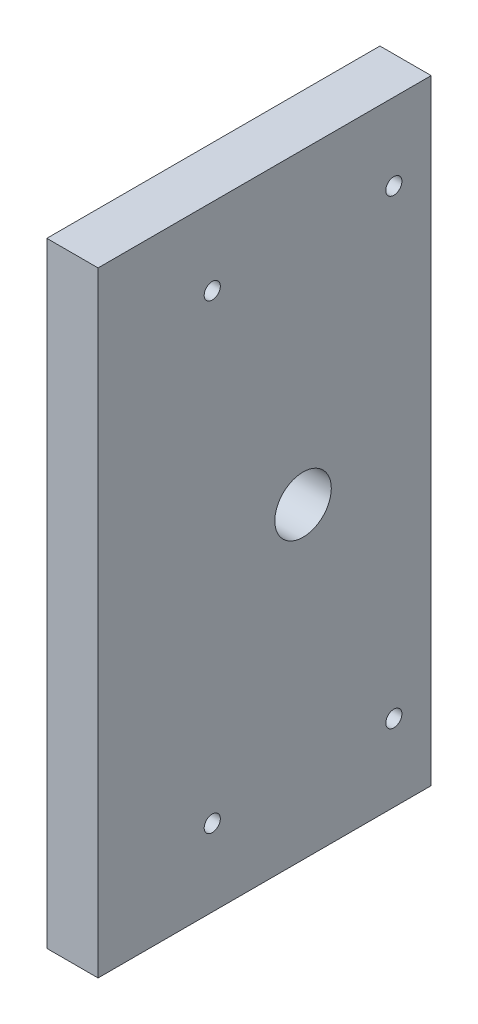
ISO-10303-21;
HEADER;
FILE_DESCRIPTION(('STEP AP214'),'2;1');
FILE_NAME('part.step','',(''),(''),'','','');
FILE_SCHEMA(('AUTOMOTIVE_DESIGN { 1 0 10303 214 1 1 1 1 }'));
ENDSEC;
DATA;
#1=APPLICATION_CONTEXT('core data for automotive mechanical design processes');
#2=APPLICATION_PROTOCOL_DEFINITION('international standard','automotive_design',2000,#1);
#3=PRODUCT_CONTEXT('',#1,'mechanical');
#4=PRODUCT('Part','Part','',(#3));
#5=PRODUCT_RELATED_PRODUCT_CATEGORY('part','',(#4));
#6=PRODUCT_DEFINITION_FORMATION('','',#4);
#7=PRODUCT_DEFINITION_CONTEXT('part definition',#1,'design');
#8=PRODUCT_DEFINITION('design','',#6,#7);
#9=PRODUCT_DEFINITION_SHAPE('','',#8);
#10=(LENGTH_UNIT() NAMED_UNIT(*) SI_UNIT(.MILLI.,.METRE.));
#11=(NAMED_UNIT(*) PLANE_ANGLE_UNIT() SI_UNIT($,.RADIAN.));
#12=(NAMED_UNIT(*) SI_UNIT($,.STERADIAN.) SOLID_ANGLE_UNIT());
#13=UNCERTAINTY_MEASURE_WITH_UNIT(LENGTH_MEASURE(1.E-05),#10,'distance_accuracy_value','');
#14=(GEOMETRIC_REPRESENTATION_CONTEXT(3) GLOBAL_UNCERTAINTY_ASSIGNED_CONTEXT((#13)) GLOBAL_UNIT_ASSIGNED_CONTEXT((#10,
#11,#12)) REPRESENTATION_CONTEXT('',''));
#15=CARTESIAN_POINT('',(0.,0.,0.));
#16=DIRECTION('',(0.,0.,1.));
#17=DIRECTION('',(1.,0.,0.));
#18=AXIS2_PLACEMENT_3D('',#15,#16,#17);
#19=CARTESIAN_POINT('',(0.,0.,-9.52499999999998));
#20=DIRECTION('',(1.,0.,0.));
#21=DIRECTION('',(0.,0.,-1.));
#22=AXIS2_PLACEMENT_3D('',#19,#20,#21);
#23=CYLINDRICAL_SURFACE('',#22,7.);
#24=CARTESIAN_POINT('',(12.7,0.,-9.52499999999998));
#25=DIRECTION('',(1.,0.,0.));
#26=DIRECTION('',(0.,0.,-1.));
#27=AXIS2_PLACEMENT_3D('',#24,#25,#26);
#28=CIRCLE('',#27,7.);
#29=CARTESIAN_POINT('',(12.7,0.,-16.525));
#30=VERTEX_POINT('',#29);
#31=EDGE_CURVE('E159',#30,#30,#28,.T.);
#32=ORIENTED_EDGE('',*,*,#31,.T.);
#33=EDGE_LOOP('',(#32));
#34=FACE_BOUND('',#33,.T.);
#35=CARTESIAN_POINT('',(1.,0.,-9.52499999999998));
#36=DIRECTION('',(-1.,0.,0.));
#37=DIRECTION('',(0.,0.,1.));
#38=AXIS2_PLACEMENT_3D('',#35,#36,#37);
#39=CIRCLE('',#38,7.);
#40=CARTESIAN_POINT('',(1.,0.,-2.52499999999998));
#41=VERTEX_POINT('',#40);
#42=EDGE_CURVE('E43',#41,#41,#39,.F.);
#43=ORIENTED_EDGE('',*,*,#42,.F.);
#44=EDGE_LOOP('',(#43));
#45=FACE_BOUND('',#44,.T.);
#46=ADVANCED_FACE('F39',(#34,#45),#23,.F.);
#47=CARTESIAN_POINT('',(12.7,76.2,-41.275));
#48=DIRECTION('',(0.,0.,1.));
#49=DIRECTION('',(0.,-1.,0.));
#50=AXIS2_PLACEMENT_3D('',#47,#48,#49);
#51=PLANE('',#50);
#52=DIRECTION('',(0.,1.,0.));
#53=VECTOR('',#52,1.);
#54=CARTESIAN_POINT('',(0.,76.2,-41.275));
#55=LINE('',#54,#53);
#56=CARTESIAN_POINT('',(0.,-76.2,-41.275));
#57=VERTEX_POINT('',#56);
#58=CARTESIAN_POINT('',(0.,76.2,-41.275));
#59=VERTEX_POINT('',#58);
#60=EDGE_CURVE('E110',#57,#59,#55,.T.);
#61=ORIENTED_EDGE('',*,*,#60,.T.);
#62=DIRECTION('',(-1.,0.,0.));
#63=VECTOR('',#62,1.);
#64=CARTESIAN_POINT('',(12.7,76.2,-41.275));
#65=LINE('',#64,#63);
#66=CARTESIAN_POINT('',(12.7,76.2,-41.275));
#67=VERTEX_POINT('',#66);
#68=EDGE_CURVE('E11',#67,#59,#65,.T.);
#69=ORIENTED_EDGE('',*,*,#68,.F.);
#70=DIRECTION('',(0.,1.,0.));
#71=VECTOR('',#70,1.);
#72=CARTESIAN_POINT('',(12.7,76.2,-41.275));
#73=LINE('',#72,#71);
#74=CARTESIAN_POINT('',(12.7,-76.2,-41.275));
#75=VERTEX_POINT('',#74);
#76=EDGE_CURVE('E93',#75,#67,#73,.T.);
#77=ORIENTED_EDGE('',*,*,#76,.F.);
#78=DIRECTION('',(-1.,0.,0.));
#79=VECTOR('',#78,1.);
#80=CARTESIAN_POINT('',(12.7,-76.2,-41.275));
#81=LINE('',#80,#79);
#82=EDGE_CURVE('E106',#75,#57,#81,.T.);
#83=ORIENTED_EDGE('',*,*,#82,.T.);
#84=EDGE_LOOP('',(#61,#69,#77,#83));
#85=FACE_BOUND('',#84,.T.);
#86=ADVANCED_FACE('F41',(#85),#51,.F.);
#87=CARTESIAN_POINT('',(12.7,76.2,41.275));
#88=DIRECTION('',(0.,-1.,0.));
#89=DIRECTION('',(0.,0.,-1.));
#90=AXIS2_PLACEMENT_3D('',#87,#88,#89);
#91=PLANE('',#90);
#92=DIRECTION('',(0.,0.,1.));
#93=VECTOR('',#92,1.);
#94=CARTESIAN_POINT('',(0.,76.2,41.275));
#95=LINE('',#94,#93);
#96=CARTESIAN_POINT('',(0.,76.2,41.275));
#97=VERTEX_POINT('',#96);
#98=EDGE_CURVE('E98',#59,#97,#95,.T.);
#99=ORIENTED_EDGE('',*,*,#98,.T.);
#100=DIRECTION('',(-1.,0.,0.));
#101=VECTOR('',#100,1.);
#102=CARTESIAN_POINT('',(12.7,76.2,41.275));
#103=LINE('',#102,#101);
#104=CARTESIAN_POINT('',(12.7,76.2,41.275));
#105=VERTEX_POINT('',#104);
#106=EDGE_CURVE('E50',#105,#97,#103,.T.);
#107=ORIENTED_EDGE('',*,*,#106,.F.);
#108=DIRECTION('',(0.,0.,1.));
#109=VECTOR('',#108,1.);
#110=CARTESIAN_POINT('',(12.7,76.2,41.275));
#111=LINE('',#110,#109);
#112=EDGE_CURVE('E88',#67,#105,#111,.T.);
#113=ORIENTED_EDGE('',*,*,#112,.F.);
#114=ORIENTED_EDGE('',*,*,#68,.T.);
#115=EDGE_LOOP('',(#99,#107,#113,#114));
#116=FACE_BOUND('',#115,.T.);
#117=ADVANCED_FACE('F97',(#116),#91,.F.);
#118=CARTESIAN_POINT('',(12.7,76.2,41.275));
#119=DIRECTION('',(0.,0.,-1.));
#120=DIRECTION('',(0.,1.,0.));
#121=AXIS2_PLACEMENT_3D('',#118,#119,#120);
#122=PLANE('',#121);
#123=DIRECTION('',(0.,-1.,0.));
#124=VECTOR('',#123,1.);
#125=CARTESIAN_POINT('',(0.,76.2,41.275));
#126=LINE('',#125,#124);
#127=CARTESIAN_POINT('',(0.,-76.2,41.275));
#128=VERTEX_POINT('',#127);
#129=EDGE_CURVE('E75',#97,#128,#126,.T.);
#130=ORIENTED_EDGE('',*,*,#129,.T.);
#131=DIRECTION('',(-1.,0.,0.));
#132=VECTOR('',#131,1.);
#133=CARTESIAN_POINT('',(12.7,-76.2,41.275));
#134=LINE('',#133,#132);
#135=CARTESIAN_POINT('',(12.7,-76.2,41.275));
#136=VERTEX_POINT('',#135);
#137=EDGE_CURVE('E100',#136,#128,#134,.T.);
#138=ORIENTED_EDGE('',*,*,#137,.F.);
#139=DIRECTION('',(0.,-1.,0.));
#140=VECTOR('',#139,1.);
#141=CARTESIAN_POINT('',(12.7,76.2,41.275));
#142=LINE('',#141,#140);
#143=EDGE_CURVE('E91',#105,#136,#142,.T.);
#144=ORIENTED_EDGE('',*,*,#143,.F.);
#145=ORIENTED_EDGE('',*,*,#106,.T.);
#146=EDGE_LOOP('',(#130,#138,#144,#145));
#147=FACE_BOUND('',#146,.T.);
#148=ADVANCED_FACE('F102',(#147),#122,.F.);
#149=CARTESIAN_POINT('',(12.7,-76.2,41.275));
#150=DIRECTION('',(0.,1.,0.));
#151=DIRECTION('',(0.,0.,1.));
#152=AXIS2_PLACEMENT_3D('',#149,#150,#151);
#153=PLANE('',#152);
#154=DIRECTION('',(0.,0.,-1.));
#155=VECTOR('',#154,1.);
#156=CARTESIAN_POINT('',(0.,-76.2,41.275));
#157=LINE('',#156,#155);
#158=EDGE_CURVE('E81',#128,#57,#157,.T.);
#159=ORIENTED_EDGE('',*,*,#158,.T.);
#160=ORIENTED_EDGE('',*,*,#82,.F.);
#161=DIRECTION('',(0.,0.,-1.));
#162=VECTOR('',#161,1.);
#163=CARTESIAN_POINT('',(12.7,-76.2,41.275));
#164=LINE('',#163,#162);
#165=EDGE_CURVE('E58',#136,#75,#164,.T.);
#166=ORIENTED_EDGE('',*,*,#165,.F.);
#167=ORIENTED_EDGE('',*,*,#137,.T.);
#168=EDGE_LOOP('',(#159,#160,#166,#167));
#169=FACE_BOUND('',#168,.T.);
#170=ADVANCED_FACE('F124',(#169),#153,.F.);
#171=CARTESIAN_POINT('',(12.7,0.,0.));
#172=DIRECTION('',(1.,0.,0.));
#173=DIRECTION('',(0.,0.,-1.));
#174=AXIS2_PLACEMENT_3D('',#171,#172,#173);
#175=PLANE('',#174);
#176=ORIENTED_EDGE('',*,*,#31,.F.);
#177=EDGE_LOOP('',(#176));
#178=FACE_BOUND('',#177,.T.);
#179=CARTESIAN_POINT('',(12.7,57.15,-32.025000042));
#180=DIRECTION('',(1.,0.,0.));
#181=DIRECTION('',(0.,0.,-1.));
#182=AXIS2_PLACEMENT_3D('',#179,#180,#181);
#183=CIRCLE('',#182,2.);
#184=CARTESIAN_POINT('',(12.7,57.15,-34.025000042));
#185=VERTEX_POINT('',#184);
#186=EDGE_CURVE('E148',#185,#185,#183,.T.);
#187=ORIENTED_EDGE('',*,*,#186,.F.);
#188=EDGE_LOOP('',(#187));
#189=FACE_BOUND('',#188,.T.);
#190=CARTESIAN_POINT('',(12.7,-57.15,12.974999958));
#191=DIRECTION('',(1.,0.,0.));
#192=DIRECTION('',(0.,0.,-1.));
#193=AXIS2_PLACEMENT_3D('',#190,#191,#192);
#194=CIRCLE('',#193,2.);
#195=CARTESIAN_POINT('',(12.7,-57.15,10.974999958));
#196=VERTEX_POINT('',#195);
#197=EDGE_CURVE('E139',#196,#196,#194,.T.);
#198=ORIENTED_EDGE('',*,*,#197,.F.);
#199=EDGE_LOOP('',(#198));
#200=FACE_BOUND('',#199,.T.);
#201=CARTESIAN_POINT('',(12.7,-57.15,-32.025000042));
#202=DIRECTION('',(1.,0.,0.));
#203=DIRECTION('',(0.,0.,-1.));
#204=AXIS2_PLACEMENT_3D('',#201,#202,#203);
#205=CIRCLE('',#204,2.);
#206=CARTESIAN_POINT('',(12.7,-57.15,-34.025000042));
#207=VERTEX_POINT('',#206);
#208=EDGE_CURVE('E155',#207,#207,#205,.T.);
#209=ORIENTED_EDGE('',*,*,#208,.F.);
#210=EDGE_LOOP('',(#209));
#211=FACE_BOUND('',#210,.T.);
#212=CARTESIAN_POINT('',(12.7,57.15,12.974999958));
#213=DIRECTION('',(1.,0.,0.));
#214=DIRECTION('',(0.,0.,-1.));
#215=AXIS2_PLACEMENT_3D('',#212,#213,#214);
#216=CIRCLE('',#215,2.);
#217=CARTESIAN_POINT('',(12.7,57.15,10.974999958));
#218=VERTEX_POINT('',#217);
#219=EDGE_CURVE('E131',#218,#218,#216,.T.);
#220=ORIENTED_EDGE('',*,*,#219,.F.);
#221=EDGE_LOOP('',(#220));
#222=FACE_BOUND('',#221,.T.);
#223=ORIENTED_EDGE('',*,*,#76,.T.);
#224=ORIENTED_EDGE('',*,*,#112,.T.);
#225=ORIENTED_EDGE('',*,*,#143,.T.);
#226=ORIENTED_EDGE('',*,*,#165,.T.);
#227=EDGE_LOOP('',(#223,#224,#225,#226));
#228=FACE_BOUND('',#227,.T.);
#229=ADVANCED_FACE('F89',(#178,#189,#200,#211,#222,#228),#175,.T.);
#230=CARTESIAN_POINT('',(0.,0.,0.));
#231=DIRECTION('',(1.,0.,0.));
#232=DIRECTION('',(0.,0.,-1.));
#233=AXIS2_PLACEMENT_3D('',#230,#231,#232);
#234=PLANE('',#233);
#235=CARTESIAN_POINT('',(0.,0.,-9.52499999999998));
#236=DIRECTION('',(-1.,0.,0.));
#237=DIRECTION('',(0.,0.,1.));
#238=AXIS2_PLACEMENT_3D('',#235,#236,#237);
#239=CIRCLE('',#238,7.5);
#240=CARTESIAN_POINT('',(0.,0.,-2.02499999999999));
#241=VERTEX_POINT('',#240);
#242=EDGE_CURVE('E166',#241,#241,#239,.T.);
#243=ORIENTED_EDGE('',*,*,#242,.F.);
#244=EDGE_LOOP('',(#243));
#245=FACE_BOUND('',#244,.T.);
#246=CARTESIAN_POINT('',(0.,57.15,-32.025000042));
#247=DIRECTION('',(1.,0.,0.));
#248=DIRECTION('',(0.,0.,-1.));
#249=AXIS2_PLACEMENT_3D('',#246,#247,#248);
#250=CIRCLE('',#249,2.);
#251=CARTESIAN_POINT('',(0.,57.15,-34.025000042));
#252=VERTEX_POINT('',#251);
#253=EDGE_CURVE('E135',#252,#252,#250,.T.);
#254=ORIENTED_EDGE('',*,*,#253,.T.);
#255=EDGE_LOOP('',(#254));
#256=FACE_BOUND('',#255,.T.);
#257=CARTESIAN_POINT('',(0.,-57.15,12.974999958));
#258=DIRECTION('',(1.,0.,0.));
#259=DIRECTION('',(0.,0.,-1.));
#260=AXIS2_PLACEMENT_3D('',#257,#258,#259);
#261=CIRCLE('',#260,2.);
#262=CARTESIAN_POINT('',(0.,-57.15,10.974999958));
#263=VERTEX_POINT('',#262);
#264=EDGE_CURVE('E143',#263,#263,#261,.T.);
#265=ORIENTED_EDGE('',*,*,#264,.T.);
#266=EDGE_LOOP('',(#265));
#267=FACE_BOUND('',#266,.T.);
#268=CARTESIAN_POINT('',(0.,-57.15,-32.025000042));
#269=DIRECTION('',(1.,0.,0.));
#270=DIRECTION('',(0.,0.,-1.));
#271=AXIS2_PLACEMENT_3D('',#268,#269,#270);
#272=CIRCLE('',#271,2.);
#273=CARTESIAN_POINT('',(0.,-57.15,-34.025000042));
#274=VERTEX_POINT('',#273);
#275=EDGE_CURVE('E144',#274,#274,#272,.T.);
#276=ORIENTED_EDGE('',*,*,#275,.T.);
#277=EDGE_LOOP('',(#276));
#278=FACE_BOUND('',#277,.T.);
#279=CARTESIAN_POINT('',(0.,57.15,12.974999958));
#280=DIRECTION('',(1.,0.,0.));
#281=DIRECTION('',(0.,0.,-1.));
#282=AXIS2_PLACEMENT_3D('',#279,#280,#281);
#283=CIRCLE('',#282,2.);
#284=CARTESIAN_POINT('',(0.,57.15,10.974999958));
#285=VERTEX_POINT('',#284);
#286=EDGE_CURVE('E114',#285,#285,#283,.T.);
#287=ORIENTED_EDGE('',*,*,#286,.T.);
#288=EDGE_LOOP('',(#287));
#289=FACE_BOUND('',#288,.T.);
#290=ORIENTED_EDGE('',*,*,#60,.F.);
#291=ORIENTED_EDGE('',*,*,#158,.F.);
#292=ORIENTED_EDGE('',*,*,#129,.F.);
#293=ORIENTED_EDGE('',*,*,#98,.F.);
#294=EDGE_LOOP('',(#290,#291,#292,#293));
#295=FACE_BOUND('',#294,.T.);
#296=ADVANCED_FACE('F127',(#245,#256,#267,#278,#289,#295),#234,.F.);
#297=CARTESIAN_POINT('',(0.,57.15,12.974999958));
#298=DIRECTION('',(1.,0.,0.));
#299=DIRECTION('',(0.,0.,-1.));
#300=AXIS2_PLACEMENT_3D('',#297,#298,#299);
#301=CYLINDRICAL_SURFACE('',#300,2.);
#302=ORIENTED_EDGE('',*,*,#286,.F.);
#303=EDGE_LOOP('',(#302));
#304=FACE_BOUND('',#303,.T.);
#305=ORIENTED_EDGE('',*,*,#219,.T.);
#306=EDGE_LOOP('',(#305));
#307=FACE_BOUND('',#306,.T.);
#308=ADVANCED_FACE('F195',(#304,#307),#301,.F.);
#309=CARTESIAN_POINT('',(0.,-57.15,-32.025000042));
#310=DIRECTION('',(1.,0.,0.));
#311=DIRECTION('',(0.,0.,-1.));
#312=AXIS2_PLACEMENT_3D('',#309,#310,#311);
#313=CYLINDRICAL_SURFACE('',#312,2.);
#314=ORIENTED_EDGE('',*,*,#275,.F.);
#315=EDGE_LOOP('',(#314));
#316=FACE_BOUND('',#315,.T.);
#317=ORIENTED_EDGE('',*,*,#208,.T.);
#318=EDGE_LOOP('',(#317));
#319=FACE_BOUND('',#318,.T.);
#320=ADVANCED_FACE('F191',(#316,#319),#313,.F.);
#321=CARTESIAN_POINT('',(0.,-57.15,12.974999958));
#322=DIRECTION('',(1.,0.,0.));
#323=DIRECTION('',(0.,0.,-1.));
#324=AXIS2_PLACEMENT_3D('',#321,#322,#323);
#325=CYLINDRICAL_SURFACE('',#324,2.);
#326=ORIENTED_EDGE('',*,*,#264,.F.);
#327=EDGE_LOOP('',(#326));
#328=FACE_BOUND('',#327,.T.);
#329=ORIENTED_EDGE('',*,*,#197,.T.);
#330=EDGE_LOOP('',(#329));
#331=FACE_BOUND('',#330,.T.);
#332=ADVANCED_FACE('F194',(#328,#331),#325,.F.);
#333=CARTESIAN_POINT('',(0.,57.15,-32.025000042));
#334=DIRECTION('',(1.,0.,0.));
#335=DIRECTION('',(0.,0.,-1.));
#336=AXIS2_PLACEMENT_3D('',#333,#334,#335);
#337=CYLINDRICAL_SURFACE('',#336,2.);
#338=ORIENTED_EDGE('',*,*,#253,.F.);
#339=EDGE_LOOP('',(#338));
#340=FACE_BOUND('',#339,.T.);
#341=ORIENTED_EDGE('',*,*,#186,.T.);
#342=EDGE_LOOP('',(#341));
#343=FACE_BOUND('',#342,.T.);
#344=ADVANCED_FACE('F197',(#340,#343),#337,.F.);
#345=CARTESIAN_POINT('',(1.,0.,-9.52499999999998));
#346=DIRECTION('',(-1.,0.,0.));
#347=DIRECTION('',(0.,0.,1.));
#348=AXIS2_PLACEMENT_3D('',#345,#346,#347);
#349=PLANE('',#348);
#350=CARTESIAN_POINT('',(1.,0.,-9.52499999999998));
#351=DIRECTION('',(-1.,0.,0.));
#352=DIRECTION('',(0.,0.,1.));
#353=AXIS2_PLACEMENT_3D('',#350,#351,#352);
#354=CIRCLE('',#353,7.5);
#355=CARTESIAN_POINT('',(1.,0.,-2.02499999999999));
#356=VERTEX_POINT('',#355);
#357=EDGE_CURVE('E170',#356,#356,#354,.T.);
#358=ORIENTED_EDGE('',*,*,#357,.T.);
#359=EDGE_LOOP('',(#358));
#360=FACE_BOUND('',#359,.T.);
#361=ORIENTED_EDGE('',*,*,#42,.T.);
#362=EDGE_LOOP('',(#361));
#363=FACE_BOUND('',#362,.T.);
#364=ADVANCED_FACE('F179',(#360,#363),#349,.T.);
#365=CARTESIAN_POINT('',(1.,0.,-9.52499999999998));
#366=DIRECTION('',(-1.,0.,0.));
#367=DIRECTION('',(0.,0.,1.));
#368=AXIS2_PLACEMENT_3D('',#365,#366,#367);
#369=CYLINDRICAL_SURFACE('',#368,7.5);
#370=ORIENTED_EDGE('',*,*,#357,.F.);
#371=EDGE_LOOP('',(#370));
#372=FACE_BOUND('',#371,.T.);
#373=ORIENTED_EDGE('',*,*,#242,.T.);
#374=EDGE_LOOP('',(#373));
#375=FACE_BOUND('',#374,.T.);
#376=ADVANCED_FACE('F189',(#372,#375),#369,.F.);
#377=CLOSED_SHELL('',(#46,#86,#117,#148,#170,#229,#296,#308,#320,#332,#344,#364,#376));
#378=MANIFOLD_SOLID_BREP('B2',#377);
#379=ADVANCED_BREP_SHAPE_REPRESENTATION('',(#18,#378),#14);
#380=SHAPE_DEFINITION_REPRESENTATION(#9,#379);
ENDSEC;
END-ISO-10303-21;
